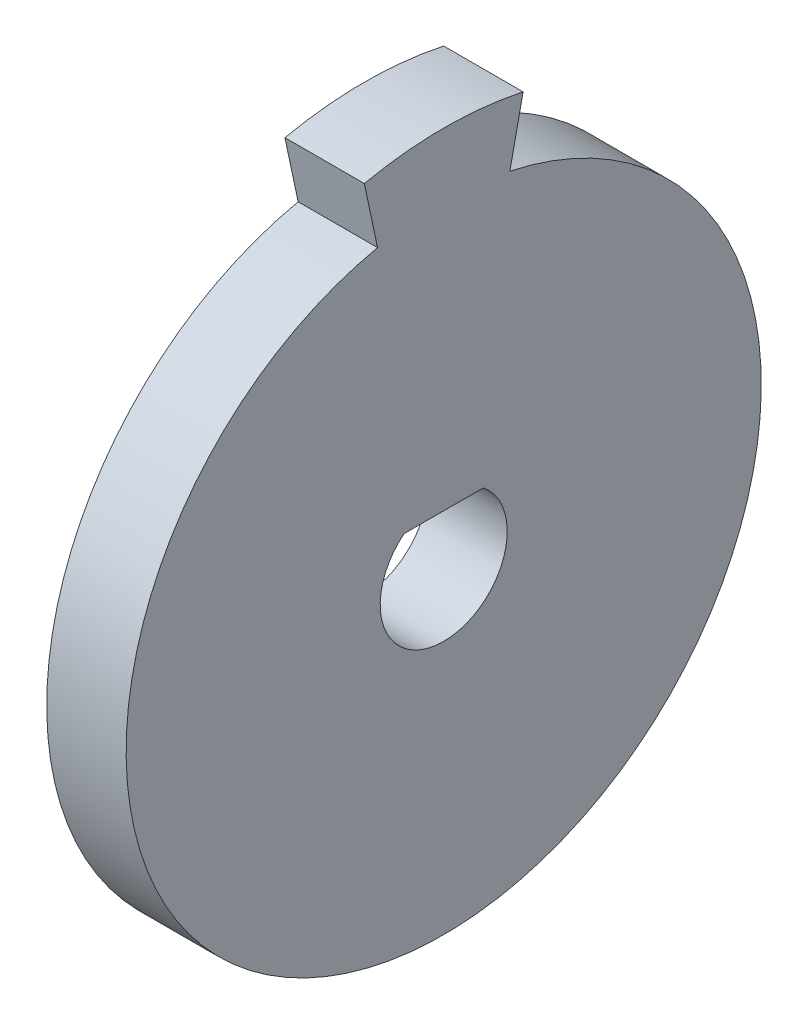
ISO-10303-21;
HEADER;
FILE_DESCRIPTION(('STEP AP214'),'2;1');
FILE_NAME('part.step','',(''),(''),'','','');
FILE_SCHEMA(('AUTOMOTIVE_DESIGN { 1 0 10303 214 1 1 1 1 }'));
ENDSEC;
DATA;
#1=APPLICATION_CONTEXT('core data for automotive mechanical design processes');
#2=APPLICATION_PROTOCOL_DEFINITION('international standard','automotive_design',2000,#1);
#3=PRODUCT_CONTEXT('',#1,'mechanical');
#4=PRODUCT('Part','Part','',(#3));
#5=PRODUCT_RELATED_PRODUCT_CATEGORY('part','',(#4));
#6=PRODUCT_DEFINITION_FORMATION('','',#4);
#7=PRODUCT_DEFINITION_CONTEXT('part definition',#1,'design');
#8=PRODUCT_DEFINITION('design','',#6,#7);
#9=PRODUCT_DEFINITION_SHAPE('','',#8);
#10=(LENGTH_UNIT() NAMED_UNIT(*) SI_UNIT(.MILLI.,.METRE.));
#11=(NAMED_UNIT(*) PLANE_ANGLE_UNIT() SI_UNIT($,.RADIAN.));
#12=(NAMED_UNIT(*) SI_UNIT($,.STERADIAN.) SOLID_ANGLE_UNIT());
#13=UNCERTAINTY_MEASURE_WITH_UNIT(LENGTH_MEASURE(1.E-05),#10,'distance_accuracy_value','');
#14=(GEOMETRIC_REPRESENTATION_CONTEXT(3) GLOBAL_UNCERTAINTY_ASSIGNED_CONTEXT((#13)) GLOBAL_UNIT_ASSIGNED_CONTEXT((#10,
#11,#12)) REPRESENTATION_CONTEXT('',''));
#15=CARTESIAN_POINT('',(0.,0.,0.));
#16=DIRECTION('',(0.,0.,1.));
#17=DIRECTION('',(1.,0.,0.));
#18=AXIS2_PLACEMENT_3D('',#15,#16,#17);
#19=CARTESIAN_POINT('',(3.175,0.,0.));
#20=DIRECTION('',(-1.,0.,0.));
#21=DIRECTION('',(0.,0.,1.));
#22=AXIS2_PLACEMENT_3D('',#19,#20,#21);
#23=CYLINDRICAL_SURFACE('',#22,25.4);
#24=DIRECTION('',(-1.,0.,0.));
#25=VECTOR('',#24,1.);
#26=CARTESIAN_POINT('',(3.175,24.8426702246133,-5.29166666666667));
#27=LINE('',#26,#25);
#28=CARTESIAN_POINT('',(3.175,24.8426702246133,-5.29166666666667));
#29=VERTEX_POINT('',#28);
#30=CARTESIAN_POINT('',(-3.175,24.8426702246133,-5.29166666666667));
#31=VERTEX_POINT('',#30);
#32=EDGE_CURVE('E97',#29,#31,#27,.T.);
#33=ORIENTED_EDGE('',*,*,#32,.F.);
#34=CARTESIAN_POINT('',(3.175,0.,0.));
#35=DIRECTION('',(1.,0.,0.));
#36=DIRECTION('',(0.,0.,-1.));
#37=AXIS2_PLACEMENT_3D('',#34,#35,#36);
#38=CIRCLE('',#37,25.4);
#39=CARTESIAN_POINT('',(3.175,24.8426702246133,5.29166666666667));
#40=VERTEX_POINT('',#39);
#41=EDGE_CURVE('E11',#40,#29,#38,.T.);
#42=ORIENTED_EDGE('',*,*,#41,.F.);
#43=DIRECTION('',(-1.,0.,0.));
#44=VECTOR('',#43,1.);
#45=CARTESIAN_POINT('',(3.175,24.8426702246133,5.29166666666667));
#46=LINE('',#45,#44);
#47=CARTESIAN_POINT('',(-3.175,24.8426702246133,5.29166666666667));
#48=VERTEX_POINT('',#47);
#49=EDGE_CURVE('E105',#40,#48,#46,.T.);
#50=ORIENTED_EDGE('',*,*,#49,.T.);
#51=CARTESIAN_POINT('',(-3.175,0.,0.));
#52=DIRECTION('',(1.,0.,0.));
#53=DIRECTION('',(0.,0.,-1.));
#54=AXIS2_PLACEMENT_3D('',#51,#52,#53);
#55=CIRCLE('',#54,25.4);
#56=EDGE_CURVE('E36',#48,#31,#55,.T.);
#57=ORIENTED_EDGE('',*,*,#56,.T.);
#58=EDGE_LOOP('',(#33,#42,#50,#57));
#59=FACE_BOUND('',#58,.T.);
#60=ADVANCED_FACE('F33',(#59),#23,.T.);
#61=CARTESIAN_POINT('',(3.175,0.,0.));
#62=DIRECTION('',(1.,0.,0.));
#63=DIRECTION('',(0.,0.,-1.));
#64=AXIS2_PLACEMENT_3D('',#61,#62,#63);
#65=PLANE('',#64);
#66=ORIENTED_EDGE('',*,*,#41,.T.);
#67=DIRECTION('',(0.,0.978057882858792,-0.208333333333334));
#68=VECTOR('',#67,1.);
#69=CARTESIAN_POINT('',(3.175,24.8426702246133,-5.29166666666667));
#70=LINE('',#69,#68);
#71=CARTESIAN_POINT('',(3.175,29.8112042695359,-6.35));
#72=VERTEX_POINT('',#71);
#73=EDGE_CURVE('E80',#29,#72,#70,.T.);
#74=ORIENTED_EDGE('',*,*,#73,.T.);
#75=CARTESIAN_POINT('',(3.175,0.,0.));
#76=DIRECTION('',(1.,0.,0.));
#77=DIRECTION('',(0.,0.,-1.));
#78=AXIS2_PLACEMENT_3D('',#75,#76,#77);
#79=CIRCLE('',#78,30.48);
#80=CARTESIAN_POINT('',(3.175,29.8112042695359,6.35));
#81=VERTEX_POINT('',#80);
#82=EDGE_CURVE('E85',#72,#81,#79,.T.);
#83=ORIENTED_EDGE('',*,*,#82,.T.);
#84=DIRECTION('',(0.,-0.978057882858792,-0.208333333333334));
#85=VECTOR('',#84,1.);
#86=CARTESIAN_POINT('',(3.175,24.8426702246133,5.29166666666667));
#87=LINE('',#86,#85);
#88=EDGE_CURVE('E103',#81,#40,#87,.T.);
#89=ORIENTED_EDGE('',*,*,#88,.T.);
#90=EDGE_LOOP('',(#66,#74,#83,#89));
#91=FACE_BOUND('',#90,.T.);
#92=DIRECTION('',(0.,0.,1.));
#93=VECTOR('',#92,1.);
#94=CARTESIAN_POINT('',(3.175,3.96557372898298,3.175));
#95=LINE('',#94,#93);
#96=CARTESIAN_POINT('',(3.175,3.96557372898298,-3.175));
#97=VERTEX_POINT('',#96);
#98=CARTESIAN_POINT('',(3.175,3.96557372898298,3.175));
#99=VERTEX_POINT('',#98);
#100=EDGE_CURVE('E120',#97,#99,#95,.T.);
#101=ORIENTED_EDGE('',*,*,#100,.F.);
#102=CARTESIAN_POINT('',(3.175,0.,0.));
#103=DIRECTION('',(1.,0.,0.));
#104=DIRECTION('',(0.,0.,-1.));
#105=AXIS2_PLACEMENT_3D('',#102,#103,#104);
#106=CIRCLE('',#105,5.08);
#107=EDGE_CURVE('E117',#99,#97,#106,.T.);
#108=ORIENTED_EDGE('',*,*,#107,.F.);
#109=EDGE_LOOP('',(#101,#108));
#110=FACE_BOUND('',#109,.T.);
#111=ADVANCED_FACE('F82',(#91,#110),#65,.T.);
#112=CARTESIAN_POINT('',(-3.175,0.,0.));
#113=DIRECTION('',(1.,0.,0.));
#114=DIRECTION('',(0.,0.,-1.));
#115=AXIS2_PLACEMENT_3D('',#112,#113,#114);
#116=PLANE('',#115);
#117=ORIENTED_EDGE('',*,*,#56,.F.);
#118=DIRECTION('',(0.,-0.978057882858792,-0.208333333333334));
#119=VECTOR('',#118,1.);
#120=CARTESIAN_POINT('',(-3.175,24.8426702246133,5.29166666666667));
#121=LINE('',#120,#119);
#122=CARTESIAN_POINT('',(-3.175,29.8112042695359,6.35));
#123=VERTEX_POINT('',#122);
#124=EDGE_CURVE('E89',#123,#48,#121,.T.);
#125=ORIENTED_EDGE('',*,*,#124,.F.);
#126=CARTESIAN_POINT('',(-3.175,0.,0.));
#127=DIRECTION('',(1.,0.,0.));
#128=DIRECTION('',(0.,0.,-1.));
#129=AXIS2_PLACEMENT_3D('',#126,#127,#128);
#130=CIRCLE('',#129,30.48);
#131=CARTESIAN_POINT('',(-3.175,29.8112042695359,-6.35));
#132=VERTEX_POINT('',#131);
#133=EDGE_CURVE('E109',#132,#123,#130,.T.);
#134=ORIENTED_EDGE('',*,*,#133,.F.);
#135=DIRECTION('',(0.,0.978057882858792,-0.208333333333334));
#136=VECTOR('',#135,1.);
#137=CARTESIAN_POINT('',(-3.175,24.8426702246133,-5.29166666666667));
#138=LINE('',#137,#136);
#139=EDGE_CURVE('E94',#31,#132,#138,.T.);
#140=ORIENTED_EDGE('',*,*,#139,.F.);
#141=EDGE_LOOP('',(#117,#125,#134,#140));
#142=FACE_BOUND('',#141,.T.);
#143=CARTESIAN_POINT('',(-3.175,0.,0.));
#144=DIRECTION('',(1.,0.,0.));
#145=DIRECTION('',(0.,0.,-1.));
#146=AXIS2_PLACEMENT_3D('',#143,#144,#145);
#147=CIRCLE('',#146,5.08);
#148=CARTESIAN_POINT('',(-3.175,3.96557372898298,3.175));
#149=VERTEX_POINT('',#148);
#150=CARTESIAN_POINT('',(-3.175,3.96557372898298,-3.175));
#151=VERTEX_POINT('',#150);
#152=EDGE_CURVE('E116',#149,#151,#147,.T.);
#153=ORIENTED_EDGE('',*,*,#152,.T.);
#154=DIRECTION('',(0.,0.,1.));
#155=VECTOR('',#154,1.);
#156=CARTESIAN_POINT('',(-3.175,3.96557372898298,3.175));
#157=LINE('',#156,#155);
#158=EDGE_CURVE('E121',#151,#149,#157,.T.);
#159=ORIENTED_EDGE('',*,*,#158,.T.);
#160=EDGE_LOOP('',(#153,#159));
#161=FACE_BOUND('',#160,.T.);
#162=ADVANCED_FACE('F139',(#142,#161),#116,.F.);
#163=CARTESIAN_POINT('',(3.175,0.,0.));
#164=DIRECTION('',(-1.,0.,0.));
#165=DIRECTION('',(0.,0.,1.));
#166=AXIS2_PLACEMENT_3D('',#163,#164,#165);
#167=CYLINDRICAL_SURFACE('',#166,5.08);
#168=ORIENTED_EDGE('',*,*,#152,.F.);
#169=DIRECTION('',(-1.,0.,0.));
#170=VECTOR('',#169,1.);
#171=CARTESIAN_POINT('',(3.175,3.96557372898298,3.175));
#172=LINE('',#171,#170);
#173=EDGE_CURVE('E123',#99,#149,#172,.T.);
#174=ORIENTED_EDGE('',*,*,#173,.F.);
#175=ORIENTED_EDGE('',*,*,#107,.T.);
#176=DIRECTION('',(-1.,0.,0.));
#177=VECTOR('',#176,1.);
#178=CARTESIAN_POINT('',(3.175,3.96557372898298,-3.175));
#179=LINE('',#178,#177);
#180=EDGE_CURVE('E130',#97,#151,#179,.T.);
#181=ORIENTED_EDGE('',*,*,#180,.T.);
#182=EDGE_LOOP('',(#168,#174,#175,#181));
#183=FACE_BOUND('',#182,.T.);
#184=ADVANCED_FACE('F133',(#183),#167,.F.);
#185=CARTESIAN_POINT('',(3.175,3.96557372898298,3.175));
#186=DIRECTION('',(0.,-1.,0.));
#187=DIRECTION('',(0.,0.,-1.));
#188=AXIS2_PLACEMENT_3D('',#185,#186,#187);
#189=PLANE('',#188);
#190=ORIENTED_EDGE('',*,*,#158,.F.);
#191=ORIENTED_EDGE('',*,*,#180,.F.);
#192=ORIENTED_EDGE('',*,*,#100,.T.);
#193=ORIENTED_EDGE('',*,*,#173,.T.);
#194=EDGE_LOOP('',(#190,#191,#192,#193));
#195=FACE_BOUND('',#194,.T.);
#196=ADVANCED_FACE('F140',(#195),#189,.T.);
#197=CARTESIAN_POINT('',(3.175,24.8426702246133,-5.29166666666667));
#198=DIRECTION('',(0.,0.208333333333334,0.978057882858792));
#199=DIRECTION('',(0.,-0.978057882858792,0.208333333333334));
#200=AXIS2_PLACEMENT_3D('',#197,#198,#199);
#201=PLANE('',#200);
#202=ORIENTED_EDGE('',*,*,#139,.T.);
#203=DIRECTION('',(-1.,0.,0.));
#204=VECTOR('',#203,1.);
#205=CARTESIAN_POINT('',(3.175,29.8112042695359,-6.35));
#206=LINE('',#205,#204);
#207=EDGE_CURVE('E92',#72,#132,#206,.T.);
#208=ORIENTED_EDGE('',*,*,#207,.F.);
#209=ORIENTED_EDGE('',*,*,#73,.F.);
#210=ORIENTED_EDGE('',*,*,#32,.T.);
#211=EDGE_LOOP('',(#202,#208,#209,#210));
#212=FACE_BOUND('',#211,.T.);
#213=ADVANCED_FACE('F93',(#212),#201,.F.);
#214=CARTESIAN_POINT('',(3.175,0.,0.));
#215=DIRECTION('',(-1.,0.,0.));
#216=DIRECTION('',(0.,0.,1.));
#217=AXIS2_PLACEMENT_3D('',#214,#215,#216);
#218=CYLINDRICAL_SURFACE('',#217,30.48);
#219=ORIENTED_EDGE('',*,*,#133,.T.);
#220=DIRECTION('',(-1.,0.,0.));
#221=VECTOR('',#220,1.);
#222=CARTESIAN_POINT('',(3.175,29.8112042695359,6.35));
#223=LINE('',#222,#221);
#224=EDGE_CURVE('E98',#81,#123,#223,.T.);
#225=ORIENTED_EDGE('',*,*,#224,.F.);
#226=ORIENTED_EDGE('',*,*,#82,.F.);
#227=ORIENTED_EDGE('',*,*,#207,.T.);
#228=EDGE_LOOP('',(#219,#225,#226,#227));
#229=FACE_BOUND('',#228,.T.);
#230=ADVANCED_FACE('F100',(#229),#218,.T.);
#231=CARTESIAN_POINT('',(3.175,24.8426702246133,5.29166666666667));
#232=DIRECTION('',(0.,0.208333333333334,-0.978057882858792));
#233=DIRECTION('',(0.,0.978057882858792,0.208333333333334));
#234=AXIS2_PLACEMENT_3D('',#231,#232,#233);
#235=PLANE('',#234);
#236=ORIENTED_EDGE('',*,*,#124,.T.);
#237=ORIENTED_EDGE('',*,*,#49,.F.);
#238=ORIENTED_EDGE('',*,*,#88,.F.);
#239=ORIENTED_EDGE('',*,*,#224,.T.);
#240=EDGE_LOOP('',(#236,#237,#238,#239));
#241=FACE_BOUND('',#240,.T.);
#242=ADVANCED_FACE('F157',(#241),#235,.F.);
#243=CLOSED_SHELL('',(#60,#111,#162,#184,#196,#213,#230,#242));
#244=MANIFOLD_SOLID_BREP('B2',#243);
#245=ADVANCED_BREP_SHAPE_REPRESENTATION('',(#18,#244),#14);
#246=SHAPE_DEFINITION_REPRESENTATION(#9,#245);
ENDSEC;
END-ISO-10303-21;
